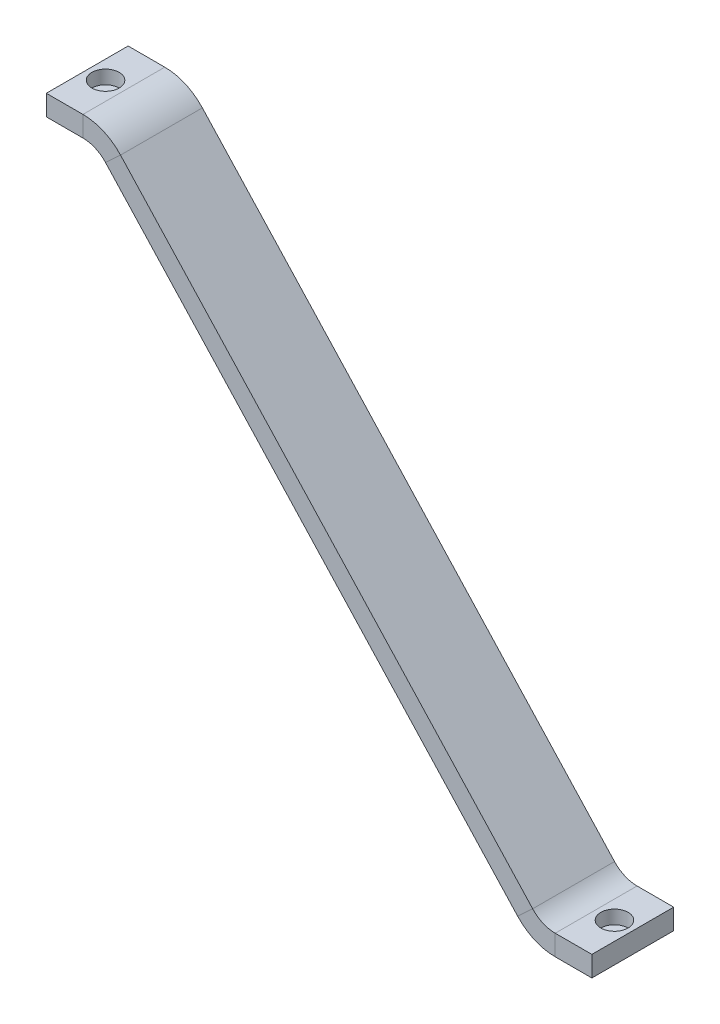
ISO-10303-21;
HEADER;
FILE_DESCRIPTION(('STEP AP214'),'2;1');
FILE_NAME('part.step','',(''),(''),'','','');
FILE_SCHEMA(('AUTOMOTIVE_DESIGN { 1 0 10303 214 1 1 1 1 }'));
ENDSEC;
DATA;
#1=APPLICATION_CONTEXT('core data for automotive mechanical design processes');
#2=APPLICATION_PROTOCOL_DEFINITION('international standard','automotive_design',2000,#1);
#3=PRODUCT_CONTEXT('',#1,'mechanical');
#4=PRODUCT('Part','Part','',(#3));
#5=PRODUCT_RELATED_PRODUCT_CATEGORY('part','',(#4));
#6=PRODUCT_DEFINITION_FORMATION('','',#4);
#7=PRODUCT_DEFINITION_CONTEXT('part definition',#1,'design');
#8=PRODUCT_DEFINITION('design','',#6,#7);
#9=PRODUCT_DEFINITION_SHAPE('','',#8);
#10=(LENGTH_UNIT() NAMED_UNIT(*) SI_UNIT(.MILLI.,.METRE.));
#11=(NAMED_UNIT(*) PLANE_ANGLE_UNIT() SI_UNIT($,.RADIAN.));
#12=(NAMED_UNIT(*) SI_UNIT($,.STERADIAN.) SOLID_ANGLE_UNIT());
#13=UNCERTAINTY_MEASURE_WITH_UNIT(LENGTH_MEASURE(1.E-05),#10,'distance_accuracy_value','');
#14=(GEOMETRIC_REPRESENTATION_CONTEXT(3) GLOBAL_UNCERTAINTY_ASSIGNED_CONTEXT((#13)) GLOBAL_UNIT_ASSIGNED_CONTEXT((#10,
#11,#12)) REPRESENTATION_CONTEXT('',''));
#15=CARTESIAN_POINT('',(0.,0.,0.));
#16=DIRECTION('',(0.,0.,1.));
#17=DIRECTION('',(1.,0.,0.));
#18=AXIS2_PLACEMENT_3D('',#15,#16,#17);
#19=CARTESIAN_POINT('',(0.,0.,0.));
#20=DIRECTION('',(1.,0.,0.));
#21=DIRECTION('',(0.,0.,-1.));
#22=AXIS2_PLACEMENT_3D('',#19,#20,#21);
#23=PLANE('',#22);
#24=DIRECTION('',(0.,1.,0.));
#25=VECTOR('',#24,1.);
#26=CARTESIAN_POINT('',(0.,7.5,-30.));
#27=LINE('',#26,#25);
#28=CARTESIAN_POINT('',(0.,-7.5,-30.));
#29=VERTEX_POINT('',#28);
#30=CARTESIAN_POINT('',(0.,7.5,-30.));
#31=VERTEX_POINT('',#30);
#32=EDGE_CURVE('E163',#29,#31,#27,.T.);
#33=ORIENTED_EDGE('',*,*,#32,.F.);
#34=DIRECTION('',(0.,0.,-1.));
#35=VECTOR('',#34,1.);
#36=CARTESIAN_POINT('',(0.,-7.5,30.));
#37=LINE('',#36,#35);
#38=CARTESIAN_POINT('',(0.,-7.5,30.));
#39=VERTEX_POINT('',#38);
#40=EDGE_CURVE('E148',#39,#29,#37,.T.);
#41=ORIENTED_EDGE('',*,*,#40,.F.);
#42=DIRECTION('',(0.,-1.,0.));
#43=VECTOR('',#42,1.);
#44=CARTESIAN_POINT('',(0.,7.5,30.));
#45=LINE('',#44,#43);
#46=CARTESIAN_POINT('',(0.,7.5,30.));
#47=VERTEX_POINT('',#46);
#48=EDGE_CURVE('E143',#47,#39,#45,.T.);
#49=ORIENTED_EDGE('',*,*,#48,.F.);
#50=DIRECTION('',(0.,0.,1.));
#51=VECTOR('',#50,1.);
#52=CARTESIAN_POINT('',(0.,7.5,30.));
#53=LINE('',#52,#51);
#54=EDGE_CURVE('E145',#31,#47,#53,.T.);
#55=ORIENTED_EDGE('',*,*,#54,.F.);
#56=EDGE_LOOP('',(#33,#41,#49,#55));
#57=FACE_BOUND('',#56,.T.);
#58=ADVANCED_FACE('F35',(#57),#23,.F.);
#59=CARTESIAN_POINT('',(400.,-346.780678499709,0.));
#60=DIRECTION('',(1.,0.,0.));
#61=DIRECTION('',(0.,0.,-1.));
#62=AXIS2_PLACEMENT_3D('',#59,#60,#61);
#63=PLANE('',#62);
#64=DIRECTION('',(0.,1.,0.));
#65=VECTOR('',#64,1.);
#66=CARTESIAN_POINT('',(400.,-339.280678499709,-30.));
#67=LINE('',#66,#65);
#68=CARTESIAN_POINT('',(400.,-354.280678499709,-30.));
#69=VERTEX_POINT('',#68);
#70=CARTESIAN_POINT('',(400.,-339.280678499709,-30.));
#71=VERTEX_POINT('',#70);
#72=EDGE_CURVE('E48',#69,#71,#67,.T.);
#73=ORIENTED_EDGE('',*,*,#72,.T.);
#74=DIRECTION('',(0.,0.,1.));
#75=VECTOR('',#74,1.);
#76=CARTESIAN_POINT('',(400.,-339.280678499709,30.));
#77=LINE('',#76,#75);
#78=CARTESIAN_POINT('',(400.,-339.280678499709,30.));
#79=VERTEX_POINT('',#78);
#80=EDGE_CURVE('E11',#71,#79,#77,.T.);
#81=ORIENTED_EDGE('',*,*,#80,.T.);
#82=DIRECTION('',(0.,-1.,0.));
#83=VECTOR('',#82,1.);
#84=CARTESIAN_POINT('',(400.,-339.280678499709,30.));
#85=LINE('',#84,#83);
#86=CARTESIAN_POINT('',(400.,-354.280678499709,30.));
#87=VERTEX_POINT('',#86);
#88=EDGE_CURVE('E205',#79,#87,#85,.T.);
#89=ORIENTED_EDGE('',*,*,#88,.T.);
#90=DIRECTION('',(0.,0.,-1.));
#91=VECTOR('',#90,1.);
#92=CARTESIAN_POINT('',(400.,-354.280678499709,30.));
#93=LINE('',#92,#91);
#94=EDGE_CURVE('E54',#87,#69,#93,.T.);
#95=ORIENTED_EDGE('',*,*,#94,.T.);
#96=EDGE_LOOP('',(#73,#81,#89,#95));
#97=FACE_BOUND('',#96,.T.);
#98=ADVANCED_FACE('F296',(#97),#63,.T.);
#99=CARTESIAN_POINT('',(0.,7.5,30.));
#100=DIRECTION('',(0.,0.,1.));
#101=DIRECTION('',(0.,-1.,0.));
#102=AXIS2_PLACEMENT_3D('',#99,#100,#101);
#103=PLANE('',#102);
#104=DIRECTION('',(1.,0.,0.));
#105=VECTOR('',#104,1.);
#106=CARTESIAN_POINT('',(0.,-7.5,30.));
#107=LINE('',#106,#105);
#108=CARTESIAN_POINT('',(26.8621334129475,-7.5,30.));
#109=VERTEX_POINT('',#108);
#110=EDGE_CURVE('E170',#39,#109,#107,.T.);
#111=ORIENTED_EDGE('',*,*,#110,.T.);
#112=DIRECTION('',(0.,-1.,0.));
#113=VECTOR('',#112,1.);
#114=CARTESIAN_POINT('',(26.8621334129475,7.5,30.));
#115=LINE('',#114,#113);
#116=CARTESIAN_POINT('',(26.8621334129475,7.5,30.));
#117=VERTEX_POINT('',#116);
#118=EDGE_CURVE('E168',#117,#109,#115,.T.);
#119=ORIENTED_EDGE('',*,*,#118,.F.);
#120=DIRECTION('',(1.,0.,0.));
#121=VECTOR('',#120,1.);
#122=CARTESIAN_POINT('',(0.,7.5,30.));
#123=LINE('',#122,#121);
#124=EDGE_CURVE('E160',#47,#117,#123,.T.);
#125=ORIENTED_EDGE('',*,*,#124,.F.);
#126=ORIENTED_EDGE('',*,*,#48,.T.);
#127=EDGE_LOOP('',(#111,#119,#125,#126));
#128=FACE_BOUND('',#127,.T.);
#129=ADVANCED_FACE('F166',(#128),#103,.T.);
#130=CARTESIAN_POINT('',(0.,-7.5,30.));
#131=DIRECTION('',(0.,-1.,0.));
#132=DIRECTION('',(0.,0.,-1.));
#133=AXIS2_PLACEMENT_3D('',#130,#131,#132);
#134=PLANE('',#133);
#135=DIRECTION('',(1.,0.,0.));
#136=VECTOR('',#135,1.);
#137=CARTESIAN_POINT('',(0.,-7.5,-30.));
#138=LINE('',#137,#136);
#139=CARTESIAN_POINT('',(26.8621334129475,-7.5,-30.));
#140=VERTEX_POINT('',#139);
#141=EDGE_CURVE('E216',#29,#140,#138,.T.);
#142=ORIENTED_EDGE('',*,*,#141,.T.);
#143=DIRECTION('',(0.,0.,-1.));
#144=VECTOR('',#143,1.);
#145=CARTESIAN_POINT('',(26.8621334129475,-7.5,30.));
#146=LINE('',#145,#144);
#147=EDGE_CURVE('E213',#109,#140,#146,.T.);
#148=ORIENTED_EDGE('',*,*,#147,.F.);
#149=ORIENTED_EDGE('',*,*,#110,.F.);
#150=ORIENTED_EDGE('',*,*,#40,.T.);
#151=EDGE_LOOP('',(#142,#148,#149,#150));
#152=FACE_BOUND('',#151,.T.);
#153=ADVANCED_FACE('F330',(#152),#134,.T.);
#154=CARTESIAN_POINT('',(0.,7.5,-30.));
#155=DIRECTION('',(0.,0.,-1.));
#156=DIRECTION('',(0.,1.,0.));
#157=AXIS2_PLACEMENT_3D('',#154,#155,#156);
#158=PLANE('',#157);
#159=DIRECTION('',(1.,0.,0.));
#160=VECTOR('',#159,1.);
#161=CARTESIAN_POINT('',(0.,7.5,-30.));
#162=LINE('',#161,#160);
#163=CARTESIAN_POINT('',(26.8621334129475,7.5,-30.));
#164=VERTEX_POINT('',#163);
#165=EDGE_CURVE('E162',#31,#164,#162,.T.);
#166=ORIENTED_EDGE('',*,*,#165,.T.);
#167=DIRECTION('',(0.,1.,0.));
#168=VECTOR('',#167,1.);
#169=CARTESIAN_POINT('',(26.8621334129475,7.5,-30.));
#170=LINE('',#169,#168);
#171=EDGE_CURVE('E219',#140,#164,#170,.T.);
#172=ORIENTED_EDGE('',*,*,#171,.F.);
#173=ORIENTED_EDGE('',*,*,#141,.F.);
#174=ORIENTED_EDGE('',*,*,#32,.T.);
#175=EDGE_LOOP('',(#166,#172,#173,#174));
#176=FACE_BOUND('',#175,.T.);
#177=ADVANCED_FACE('F281',(#176),#158,.T.);
#178=CARTESIAN_POINT('',(0.,7.5,30.));
#179=DIRECTION('',(0.,1.,0.));
#180=DIRECTION('',(0.,0.,1.));
#181=AXIS2_PLACEMENT_3D('',#178,#179,#180);
#182=PLANE('',#181);
#183=CARTESIAN_POINT('',(13.4310667064737,7.5,0.));
#184=DIRECTION('',(0.,1.,0.));
#185=DIRECTION('',(0.,0.,1.));
#186=AXIS2_PLACEMENT_3D('',#183,#184,#185);
#187=CIRCLE('',#186,10.);
#188=CARTESIAN_POINT('',(13.4310667064737,7.5,10.));
#189=VERTEX_POINT('',#188);
#190=EDGE_CURVE('E523',#189,#189,#187,.T.);
#191=ORIENTED_EDGE('',*,*,#190,.F.);
#192=EDGE_LOOP('',(#191));
#193=FACE_BOUND('',#192,.T.);
#194=DIRECTION('',(0.,0.,1.));
#195=VECTOR('',#194,1.);
#196=CARTESIAN_POINT('',(26.8621334129475,7.5,30.));
#197=LINE('',#196,#195);
#198=EDGE_CURVE('E184',#164,#117,#197,.T.);
#199=ORIENTED_EDGE('',*,*,#198,.F.);
#200=ORIENTED_EDGE('',*,*,#165,.F.);
#201=ORIENTED_EDGE('',*,*,#54,.T.);
#202=ORIENTED_EDGE('',*,*,#124,.T.);
#203=EDGE_LOOP('',(#199,#200,#201,#202));
#204=FACE_BOUND('',#203,.T.);
#205=ADVANCED_FACE('F159',(#193,#204),#182,.T.);
#206=CARTESIAN_POINT('',(26.8621334129475,7.50000000000001,30.));
#207=DIRECTION('',(0.,0.,1.));
#208=DIRECTION('',(1.,0.,0.));
#209=AXIS2_PLACEMENT_3D('',#206,#207,#208);
#210=PLANE('',#209);
#211=CARTESIAN_POINT('',(26.8621334129475,-30.,30.));
#212=DIRECTION('',(0.,0.,-1.));
#213=DIRECTION('',(0.,1.,0.));
#214=AXIS2_PLACEMENT_3D('',#211,#212,#213);
#215=CIRCLE('',#214,22.5);
#216=CARTESIAN_POINT('',(43.3977118038216,-14.7414074279684,30.));
#217=VERTEX_POINT('',#216);
#218=EDGE_CURVE('E177',#109,#217,#215,.T.);
#219=ORIENTED_EDGE('',*,*,#218,.T.);
#220=DIRECTION('',(-0.734914595149961,-0.678159669868069,0.));
#221=VECTOR('',#220,1.);
#222=CARTESIAN_POINT('',(54.421430731071,-4.5690123799474,30.));
#223=LINE('',#222,#221);
#224=CARTESIAN_POINT('',(54.421430731071,-4.5690123799474,30.));
#225=VERTEX_POINT('',#224);
#226=EDGE_CURVE('E174',#225,#217,#223,.T.);
#227=ORIENTED_EDGE('',*,*,#226,.F.);
#228=CARTESIAN_POINT('',(26.8621334129475,-30.,30.));
#229=DIRECTION('',(0.,0.,-1.));
#230=DIRECTION('',(0.,1.,0.));
#231=AXIS2_PLACEMENT_3D('',#228,#229,#230);
#232=CIRCLE('',#231,37.5);
#233=EDGE_CURVE('E178',#117,#225,#232,.T.);
#234=ORIENTED_EDGE('',*,*,#233,.F.);
#235=ORIENTED_EDGE('',*,*,#118,.T.);
#236=EDGE_LOOP('',(#219,#227,#234,#235));
#237=FACE_BOUND('',#236,.T.);
#238=ADVANCED_FACE('F277',(#237),#210,.T.);
#239=CARTESIAN_POINT('',(26.8621334129475,-30.,0.));
#240=DIRECTION('',(0.,0.,-1.));
#241=DIRECTION('',(-1.,0.,0.));
#242=AXIS2_PLACEMENT_3D('',#239,#240,#241);
#243=CYLINDRICAL_SURFACE('',#242,22.5);
#244=CARTESIAN_POINT('',(26.8621334129475,-30.,-30.));
#245=DIRECTION('',(0.,0.,-1.));
#246=DIRECTION('',(0.,1.,0.));
#247=AXIS2_PLACEMENT_3D('',#244,#245,#246);
#248=CIRCLE('',#247,22.5);
#249=CARTESIAN_POINT('',(43.3977118038216,-14.7414074279684,-30.));
#250=VERTEX_POINT('',#249);
#251=EDGE_CURVE('E222',#140,#250,#248,.T.);
#252=ORIENTED_EDGE('',*,*,#251,.T.);
#253=DIRECTION('',(0.,0.,-1.));
#254=VECTOR('',#253,1.);
#255=CARTESIAN_POINT('',(43.3977118038216,-14.7414074279684,30.));
#256=LINE('',#255,#254);
#257=EDGE_CURVE('E181',#217,#250,#256,.T.);
#258=ORIENTED_EDGE('',*,*,#257,.F.);
#259=ORIENTED_EDGE('',*,*,#218,.F.);
#260=ORIENTED_EDGE('',*,*,#147,.T.);
#261=EDGE_LOOP('',(#252,#258,#259,#260));
#262=FACE_BOUND('',#261,.T.);
#263=ADVANCED_FACE('F288',(#262),#243,.F.);
#264=CARTESIAN_POINT('',(26.8621334129475,7.50000000000001,-30.));
#265=DIRECTION('',(0.,0.,-1.));
#266=DIRECTION('',(-1.,0.,0.));
#267=AXIS2_PLACEMENT_3D('',#264,#265,#266);
#268=PLANE('',#267);
#269=CARTESIAN_POINT('',(26.8621334129475,-30.,-30.));
#270=DIRECTION('',(0.,0.,-1.));
#271=DIRECTION('',(0.,1.,0.));
#272=AXIS2_PLACEMENT_3D('',#269,#270,#271);
#273=CIRCLE('',#272,37.5);
#274=CARTESIAN_POINT('',(54.421430731071,-4.5690123799474,-30.));
#275=VERTEX_POINT('',#274);
#276=EDGE_CURVE('E242',#164,#275,#273,.T.);
#277=ORIENTED_EDGE('',*,*,#276,.T.);
#278=DIRECTION('',(0.734914595149961,0.678159669868069,0.));
#279=VECTOR('',#278,1.);
#280=CARTESIAN_POINT('',(54.421430731071,-4.5690123799474,-30.));
#281=LINE('',#280,#279);
#282=EDGE_CURVE('E225',#250,#275,#281,.T.);
#283=ORIENTED_EDGE('',*,*,#282,.F.);
#284=ORIENTED_EDGE('',*,*,#251,.F.);
#285=ORIENTED_EDGE('',*,*,#171,.T.);
#286=EDGE_LOOP('',(#277,#283,#284,#285));
#287=FACE_BOUND('',#286,.T.);
#288=ADVANCED_FACE('F284',(#287),#268,.T.);
#289=CARTESIAN_POINT('',(26.8621334129475,-30.,0.));
#290=DIRECTION('',(0.,0.,-1.));
#291=DIRECTION('',(-1.,0.,0.));
#292=AXIS2_PLACEMENT_3D('',#289,#290,#291);
#293=CYLINDRICAL_SURFACE('',#292,37.5);
#294=DIRECTION('',(0.,0.,1.));
#295=VECTOR('',#294,1.);
#296=CARTESIAN_POINT('',(54.421430731071,-4.5690123799474,30.));
#297=LINE('',#296,#295);
#298=EDGE_CURVE('E195',#275,#225,#297,.T.);
#299=ORIENTED_EDGE('',*,*,#298,.F.);
#300=ORIENTED_EDGE('',*,*,#276,.F.);
#301=ORIENTED_EDGE('',*,*,#198,.T.);
#302=ORIENTED_EDGE('',*,*,#233,.T.);
#303=EDGE_LOOP('',(#299,#300,#301,#302));
#304=FACE_BOUND('',#303,.T.);
#305=ADVANCED_FACE('F278',(#304),#293,.T.);
#306=CARTESIAN_POINT('',(54.421430731071,-4.5690123799474,30.));
#307=DIRECTION('',(0.,0.,1.));
#308=DIRECTION('',(1.,0.,0.));
#309=AXIS2_PLACEMENT_3D('',#306,#307,#308);
#310=PLANE('',#309);
#311=DIRECTION('',(0.678159669868069,-0.734914595149961,0.));
#312=VECTOR('',#311,1.);
#313=CARTESIAN_POINT('',(43.3977118038216,-14.7414074279684,30.));
#314=LINE('',#313,#312);
#315=CARTESIAN_POINT('',(345.578569268929,-342.211666119762,30.));
#316=VERTEX_POINT('',#315);
#317=EDGE_CURVE('E188',#217,#316,#314,.T.);
#318=ORIENTED_EDGE('',*,*,#317,.T.);
#319=DIRECTION('',(-0.734914595149961,-0.678159669868069,0.));
#320=VECTOR('',#319,1.);
#321=CARTESIAN_POINT('',(356.602288196179,-332.039271071741,30.));
#322=LINE('',#321,#320);
#323=CARTESIAN_POINT('',(356.602288196179,-332.039271071741,30.));
#324=VERTEX_POINT('',#323);
#325=EDGE_CURVE('E185',#324,#316,#322,.T.);
#326=ORIENTED_EDGE('',*,*,#325,.F.);
#327=DIRECTION('',(0.678159669868069,-0.734914595149961,0.));
#328=VECTOR('',#327,1.);
#329=CARTESIAN_POINT('',(54.421430731071,-4.5690123799474,30.));
#330=LINE('',#329,#328);
#331=EDGE_CURVE('E189',#225,#324,#330,.T.);
#332=ORIENTED_EDGE('',*,*,#331,.F.);
#333=ORIENTED_EDGE('',*,*,#226,.T.);
#334=EDGE_LOOP('',(#318,#326,#332,#333));
#335=FACE_BOUND('',#334,.T.);
#336=ADVANCED_FACE('F271',(#335),#310,.T.);
#337=CARTESIAN_POINT('',(43.3977118038216,-14.7414074279684,30.));
#338=DIRECTION('',(-0.734914595149961,-0.678159669868069,0.));
#339=DIRECTION('',(0.678159669868069,-0.734914595149961,0.));
#340=AXIS2_PLACEMENT_3D('',#337,#338,#339);
#341=PLANE('',#340);
#342=DIRECTION('',(0.678159669868069,-0.734914595149961,0.));
#343=VECTOR('',#342,1.);
#344=CARTESIAN_POINT('',(43.3977118038216,-14.7414074279684,-30.));
#345=LINE('',#344,#343);
#346=CARTESIAN_POINT('',(345.578569268929,-342.211666119762,-30.));
#347=VERTEX_POINT('',#346);
#348=EDGE_CURVE('E227',#250,#347,#345,.T.);
#349=ORIENTED_EDGE('',*,*,#348,.T.);
#350=DIRECTION('',(0.,0.,-1.));
#351=VECTOR('',#350,1.);
#352=CARTESIAN_POINT('',(345.578569268929,-342.211666119762,30.));
#353=LINE('',#352,#351);
#354=EDGE_CURVE('E192',#316,#347,#353,.T.);
#355=ORIENTED_EDGE('',*,*,#354,.F.);
#356=ORIENTED_EDGE('',*,*,#317,.F.);
#357=ORIENTED_EDGE('',*,*,#257,.T.);
#358=EDGE_LOOP('',(#349,#355,#356,#357));
#359=FACE_BOUND('',#358,.T.);
#360=ADVANCED_FACE('F291',(#359),#341,.T.);
#361=CARTESIAN_POINT('',(54.421430731071,-4.5690123799474,-30.));
#362=DIRECTION('',(0.,0.,-1.));
#363=DIRECTION('',(-1.,0.,0.));
#364=AXIS2_PLACEMENT_3D('',#361,#362,#363);
#365=PLANE('',#364);
#366=DIRECTION('',(0.678159669868069,-0.734914595149961,0.));
#367=VECTOR('',#366,1.);
#368=CARTESIAN_POINT('',(54.421430731071,-4.5690123799474,-30.));
#369=LINE('',#368,#367);
#370=CARTESIAN_POINT('',(356.602288196179,-332.039271071741,-30.));
#371=VERTEX_POINT('',#370);
#372=EDGE_CURVE('E246',#275,#371,#369,.T.);
#373=ORIENTED_EDGE('',*,*,#372,.T.);
#374=DIRECTION('',(0.734914595149961,0.678159669868069,0.));
#375=VECTOR('',#374,1.);
#376=CARTESIAN_POINT('',(356.602288196179,-332.039271071741,-30.));
#377=LINE('',#376,#375);
#378=EDGE_CURVE('E230',#347,#371,#377,.T.);
#379=ORIENTED_EDGE('',*,*,#378,.F.);
#380=ORIENTED_EDGE('',*,*,#348,.F.);
#381=ORIENTED_EDGE('',*,*,#282,.T.);
#382=EDGE_LOOP('',(#373,#379,#380,#381));
#383=FACE_BOUND('',#382,.T.);
#384=ADVANCED_FACE('F300',(#383),#365,.T.);
#385=CARTESIAN_POINT('',(54.421430731071,-4.5690123799474,30.));
#386=DIRECTION('',(0.734914595149961,0.678159669868069,0.));
#387=DIRECTION('',(-0.678159669868069,0.734914595149961,0.));
#388=AXIS2_PLACEMENT_3D('',#385,#386,#387);
#389=PLANE('',#388);
#390=DIRECTION('',(0.,0.,1.));
#391=VECTOR('',#390,1.);
#392=CARTESIAN_POINT('',(356.602288196179,-332.039271071741,30.));
#393=LINE('',#392,#391);
#394=EDGE_CURVE('E204',#371,#324,#393,.T.);
#395=ORIENTED_EDGE('',*,*,#394,.F.);
#396=ORIENTED_EDGE('',*,*,#372,.F.);
#397=ORIENTED_EDGE('',*,*,#298,.T.);
#398=ORIENTED_EDGE('',*,*,#331,.T.);
#399=EDGE_LOOP('',(#395,#396,#397,#398));
#400=FACE_BOUND('',#399,.T.);
#401=ADVANCED_FACE('F272',(#400),#389,.T.);
#402=CARTESIAN_POINT('',(356.602288196179,-332.03927107174,30.));
#403=DIRECTION('',(0.,0.,1.));
#404=DIRECTION('',(1.,0.,0.));
#405=AXIS2_PLACEMENT_3D('',#402,#403,#404);
#406=PLANE('',#405);
#407=CARTESIAN_POINT('',(373.137866587053,-316.780678499709,30.));
#408=DIRECTION('',(0.,0.,1.));
#409=DIRECTION('',(-0.734914595149962,-0.678159669868069,0.));
#410=AXIS2_PLACEMENT_3D('',#407,#408,#409);
#411=CIRCLE('',#410,37.5);
#412=CARTESIAN_POINT('',(373.137866587053,-354.280678499709,30.));
#413=VERTEX_POINT('',#412);
#414=EDGE_CURVE('E124',#316,#413,#411,.T.);
#415=ORIENTED_EDGE('',*,*,#414,.T.);
#416=DIRECTION('',(0.,-1.,0.));
#417=VECTOR('',#416,1.);
#418=CARTESIAN_POINT('',(373.137866587053,-339.280678499709,30.));
#419=LINE('',#418,#417);
#420=CARTESIAN_POINT('',(373.137866587053,-339.280678499709,30.));
#421=VERTEX_POINT('',#420);
#422=EDGE_CURVE('E196',#421,#413,#419,.T.);
#423=ORIENTED_EDGE('',*,*,#422,.F.);
#424=CARTESIAN_POINT('',(373.137866587053,-316.780678499709,30.));
#425=DIRECTION('',(0.,0.,1.));
#426=DIRECTION('',(-0.734914595149962,-0.678159669868068,0.));
#427=AXIS2_PLACEMENT_3D('',#424,#425,#426);
#428=CIRCLE('',#427,22.5);
#429=EDGE_CURVE('E199',#324,#421,#428,.T.);
#430=ORIENTED_EDGE('',*,*,#429,.F.);
#431=ORIENTED_EDGE('',*,*,#325,.T.);
#432=EDGE_LOOP('',(#415,#423,#430,#431));
#433=FACE_BOUND('',#432,.T.);
#434=ADVANCED_FACE('F264',(#433),#406,.T.);
#435=CARTESIAN_POINT('',(373.137866587053,-316.780678499709,0.));
#436=DIRECTION('',(0.,0.,1.));
#437=DIRECTION('',(1.,0.,0.));
#438=AXIS2_PLACEMENT_3D('',#435,#436,#437);
#439=CYLINDRICAL_SURFACE('',#438,37.5);
#440=CARTESIAN_POINT('',(373.137866587053,-316.780678499709,-30.));
#441=DIRECTION('',(0.,0.,1.));
#442=DIRECTION('',(-0.734914595149962,-0.678159669868069,0.));
#443=AXIS2_PLACEMENT_3D('',#440,#441,#442);
#444=CIRCLE('',#443,37.5);
#445=CARTESIAN_POINT('',(373.137866587053,-354.280678499709,-30.));
#446=VERTEX_POINT('',#445);
#447=EDGE_CURVE('E118',#347,#446,#444,.T.);
#448=ORIENTED_EDGE('',*,*,#447,.T.);
#449=DIRECTION('',(0.,0.,-1.));
#450=VECTOR('',#449,1.);
#451=CARTESIAN_POINT('',(373.137866587053,-354.280678499709,30.));
#452=LINE('',#451,#450);
#453=EDGE_CURVE('E201',#413,#446,#452,.T.);
#454=ORIENTED_EDGE('',*,*,#453,.F.);
#455=ORIENTED_EDGE('',*,*,#414,.F.);
#456=ORIENTED_EDGE('',*,*,#354,.T.);
#457=EDGE_LOOP('',(#448,#454,#455,#456));
#458=FACE_BOUND('',#457,.T.);
#459=ADVANCED_FACE('F292',(#458),#439,.T.);
#460=CARTESIAN_POINT('',(356.602288196179,-332.03927107174,-30.));
#461=DIRECTION('',(0.,0.,-1.));
#462=DIRECTION('',(-1.,0.,0.));
#463=AXIS2_PLACEMENT_3D('',#460,#461,#462);
#464=PLANE('',#463);
#465=CARTESIAN_POINT('',(373.137866587053,-316.780678499709,-30.));
#466=DIRECTION('',(0.,0.,1.));
#467=DIRECTION('',(-0.734914595149962,-0.678159669868068,0.));
#468=AXIS2_PLACEMENT_3D('',#465,#466,#467);
#469=CIRCLE('',#468,22.5);
#470=CARTESIAN_POINT('',(373.137866587053,-339.280678499709,-30.));
#471=VERTEX_POINT('',#470);
#472=EDGE_CURVE('E250',#371,#471,#469,.T.);
#473=ORIENTED_EDGE('',*,*,#472,.T.);
#474=DIRECTION('',(0.,1.,0.));
#475=VECTOR('',#474,1.);
#476=CARTESIAN_POINT('',(373.137866587053,-339.280678499709,-30.));
#477=LINE('',#476,#475);
#478=EDGE_CURVE('E233',#446,#471,#477,.T.);
#479=ORIENTED_EDGE('',*,*,#478,.F.);
#480=ORIENTED_EDGE('',*,*,#447,.F.);
#481=ORIENTED_EDGE('',*,*,#378,.T.);
#482=EDGE_LOOP('',(#473,#479,#480,#481));
#483=FACE_BOUND('',#482,.T.);
#484=ADVANCED_FACE('F298',(#483),#464,.T.);
#485=CARTESIAN_POINT('',(373.137866587053,-316.780678499709,0.));
#486=DIRECTION('',(0.,0.,1.));
#487=DIRECTION('',(1.,0.,0.));
#488=AXIS2_PLACEMENT_3D('',#485,#486,#487);
#489=CYLINDRICAL_SURFACE('',#488,22.5);
#490=DIRECTION('',(0.,0.,1.));
#491=VECTOR('',#490,1.);
#492=CARTESIAN_POINT('',(373.137866587053,-339.280678499709,30.));
#493=LINE('',#492,#491);
#494=EDGE_CURVE('E211',#471,#421,#493,.T.);
#495=ORIENTED_EDGE('',*,*,#494,.F.);
#496=ORIENTED_EDGE('',*,*,#472,.F.);
#497=ORIENTED_EDGE('',*,*,#394,.T.);
#498=ORIENTED_EDGE('',*,*,#429,.T.);
#499=EDGE_LOOP('',(#495,#496,#497,#498));
#500=FACE_BOUND('',#499,.T.);
#501=ADVANCED_FACE('F266',(#500),#489,.F.);
#502=CARTESIAN_POINT('',(373.137866587053,-339.280678499709,30.));
#503=DIRECTION('',(0.,0.,1.));
#504=DIRECTION('',(0.,-1.,0.));
#505=AXIS2_PLACEMENT_3D('',#502,#503,#504);
#506=PLANE('',#505);
#507=DIRECTION('',(1.,0.,0.));
#508=VECTOR('',#507,1.);
#509=CARTESIAN_POINT('',(373.137866587053,-354.280678499709,30.));
#510=LINE('',#509,#508);
#511=EDGE_CURVE('E99',#413,#87,#510,.T.);
#512=ORIENTED_EDGE('',*,*,#511,.T.);
#513=ORIENTED_EDGE('',*,*,#88,.F.);
#514=DIRECTION('',(1.,0.,0.));
#515=VECTOR('',#514,1.);
#516=CARTESIAN_POINT('',(373.137866587053,-339.280678499709,30.));
#517=LINE('',#516,#515);
#518=EDGE_CURVE('E207',#421,#79,#517,.T.);
#519=ORIENTED_EDGE('',*,*,#518,.F.);
#520=ORIENTED_EDGE('',*,*,#422,.T.);
#521=EDGE_LOOP('',(#512,#513,#519,#520));
#522=FACE_BOUND('',#521,.T.);
#523=ADVANCED_FACE('F295',(#522),#506,.T.);
#524=CARTESIAN_POINT('',(373.137866587053,-354.280678499709,30.));
#525=DIRECTION('',(0.,-1.,0.));
#526=DIRECTION('',(0.,0.,-1.));
#527=AXIS2_PLACEMENT_3D('',#524,#525,#526);
#528=PLANE('',#527);
#529=DIRECTION('',(1.,0.,0.));
#530=VECTOR('',#529,1.);
#531=CARTESIAN_POINT('',(373.137866587053,-354.280678499709,-30.));
#532=LINE('',#531,#530);
#533=EDGE_CURVE('E92',#446,#69,#532,.T.);
#534=ORIENTED_EDGE('',*,*,#533,.T.);
#535=ORIENTED_EDGE('',*,*,#94,.F.);
#536=ORIENTED_EDGE('',*,*,#511,.F.);
#537=ORIENTED_EDGE('',*,*,#453,.T.);
#538=EDGE_LOOP('',(#534,#535,#536,#537));
#539=FACE_BOUND('',#538,.T.);
#540=ADVANCED_FACE('F293',(#539),#528,.T.);
#541=CARTESIAN_POINT('',(373.137866587053,-339.280678499709,-30.));
#542=DIRECTION('',(0.,0.,-1.));
#543=DIRECTION('',(0.,1.,0.));
#544=AXIS2_PLACEMENT_3D('',#541,#542,#543);
#545=PLANE('',#544);
#546=DIRECTION('',(1.,0.,0.));
#547=VECTOR('',#546,1.);
#548=CARTESIAN_POINT('',(373.137866587053,-339.280678499709,-30.));
#549=LINE('',#548,#547);
#550=EDGE_CURVE('E42',#471,#71,#549,.T.);
#551=ORIENTED_EDGE('',*,*,#550,.T.);
#552=ORIENTED_EDGE('',*,*,#72,.F.);
#553=ORIENTED_EDGE('',*,*,#533,.F.);
#554=ORIENTED_EDGE('',*,*,#478,.T.);
#555=EDGE_LOOP('',(#551,#552,#553,#554));
#556=FACE_BOUND('',#555,.T.);
#557=ADVANCED_FACE('F297',(#556),#545,.T.);
#558=CARTESIAN_POINT('',(373.137866587053,-339.280678499709,30.));
#559=DIRECTION('',(0.,1.,0.));
#560=DIRECTION('',(0.,0.,1.));
#561=AXIS2_PLACEMENT_3D('',#558,#559,#560);
#562=PLANE('',#561);
#563=CARTESIAN_POINT('',(386.568933293526,-339.280678499709,0.));
#564=DIRECTION('',(0.,1.,0.));
#565=DIRECTION('',(-1.,0.,0.));
#566=AXIS2_PLACEMENT_3D('',#563,#564,#565);
#567=CIRCLE('',#566,9.99999999999998);
#568=CARTESIAN_POINT('',(376.568933293526,-339.280678499709,0.));
#569=VERTEX_POINT('',#568);
#570=EDGE_CURVE('E524',#569,#569,#567,.T.);
#571=ORIENTED_EDGE('',*,*,#570,.F.);
#572=EDGE_LOOP('',(#571));
#573=FACE_BOUND('',#572,.T.);
#574=ORIENTED_EDGE('',*,*,#80,.F.);
#575=ORIENTED_EDGE('',*,*,#550,.F.);
#576=ORIENTED_EDGE('',*,*,#494,.T.);
#577=ORIENTED_EDGE('',*,*,#518,.T.);
#578=EDGE_LOOP('',(#574,#575,#576,#577));
#579=FACE_BOUND('',#578,.T.);
#580=ADVANCED_FACE('F261',(#573,#579),#562,.T.);
#581=CARTESIAN_POINT('',(13.4310667064737,-2.5,0.));
#582=DIRECTION('',(0.,1.,0.));
#583=DIRECTION('',(0.,0.,1.));
#584=AXIS2_PLACEMENT_3D('',#581,#582,#583);
#585=CYLINDRICAL_SURFACE('',#584,10.);
#586=CARTESIAN_POINT('',(13.4310667064737,-2.5,0.));
#587=DIRECTION('',(0.,1.,0.));
#588=DIRECTION('',(0.,0.,1.));
#589=AXIS2_PLACEMENT_3D('',#586,#587,#588);
#590=CIRCLE('',#589,10.);
#591=CARTESIAN_POINT('',(13.4310667064737,-2.5,10.));
#592=VERTEX_POINT('',#591);
#593=EDGE_CURVE('E153',#592,#592,#590,.T.);
#594=ORIENTED_EDGE('',*,*,#593,.F.);
#595=EDGE_LOOP('',(#594));
#596=FACE_BOUND('',#595,.T.);
#597=ORIENTED_EDGE('',*,*,#190,.T.);
#598=EDGE_LOOP('',(#597));
#599=FACE_BOUND('',#598,.T.);
#600=ADVANCED_FACE('F312',(#596,#599),#585,.F.);
#601=CARTESIAN_POINT('',(13.4310667064737,-2.5,0.));
#602=DIRECTION('',(0.,1.,0.));
#603=DIRECTION('',(0.,0.,1.));
#604=AXIS2_PLACEMENT_3D('',#601,#602,#603);
#605=PLANE('',#604);
#606=ORIENTED_EDGE('',*,*,#593,.T.);
#607=EDGE_LOOP('',(#606));
#608=FACE_BOUND('',#607,.T.);
#609=ADVANCED_FACE('F319',(#608),#605,.T.);
#610=CARTESIAN_POINT('',(386.568933293526,-349.280678499709,0.));
#611=DIRECTION('',(0.,1.,0.));
#612=DIRECTION('',(-1.,0.,0.));
#613=AXIS2_PLACEMENT_3D('',#610,#611,#612);
#614=CYLINDRICAL_SURFACE('',#613,9.99999999999998);
#615=CARTESIAN_POINT('',(386.568933293526,-349.280678499709,0.));
#616=DIRECTION('',(0.,1.,0.));
#617=DIRECTION('',(-1.,0.,0.));
#618=AXIS2_PLACEMENT_3D('',#615,#616,#617);
#619=CIRCLE('',#618,9.99999999999998);
#620=CARTESIAN_POINT('',(376.568933293526,-349.280678499709,0.));
#621=VERTEX_POINT('',#620);
#622=EDGE_CURVE('E522',#621,#621,#619,.T.);
#623=ORIENTED_EDGE('',*,*,#622,.F.);
#624=EDGE_LOOP('',(#623));
#625=FACE_BOUND('',#624,.T.);
#626=ORIENTED_EDGE('',*,*,#570,.T.);
#627=EDGE_LOOP('',(#626));
#628=FACE_BOUND('',#627,.T.);
#629=ADVANCED_FACE('F492',(#625,#628),#614,.F.);
#630=CARTESIAN_POINT('',(386.568933293526,-349.280678499709,0.));
#631=DIRECTION('',(0.,1.,0.));
#632=DIRECTION('',(-1.,0.,0.));
#633=AXIS2_PLACEMENT_3D('',#630,#631,#632);
#634=PLANE('',#633);
#635=ORIENTED_EDGE('',*,*,#622,.T.);
#636=EDGE_LOOP('',(#635));
#637=FACE_BOUND('',#636,.T.);
#638=ADVANCED_FACE('F506',(#637),#634,.T.);
#639=CLOSED_SHELL('',(#58,#98,#129,#153,#177,#205,#238,#263,#288,#305,#336,#360,#384,#401,#434,
#459,#484,#501,#523,#540,#557,#580,#600,#609,#629,#638));
#640=MANIFOLD_SOLID_BREP('B2',#639);
#641=ADVANCED_BREP_SHAPE_REPRESENTATION('',(#18,#640),#14);
#642=SHAPE_DEFINITION_REPRESENTATION(#9,#641);
ENDSEC;
END-ISO-10303-21;
